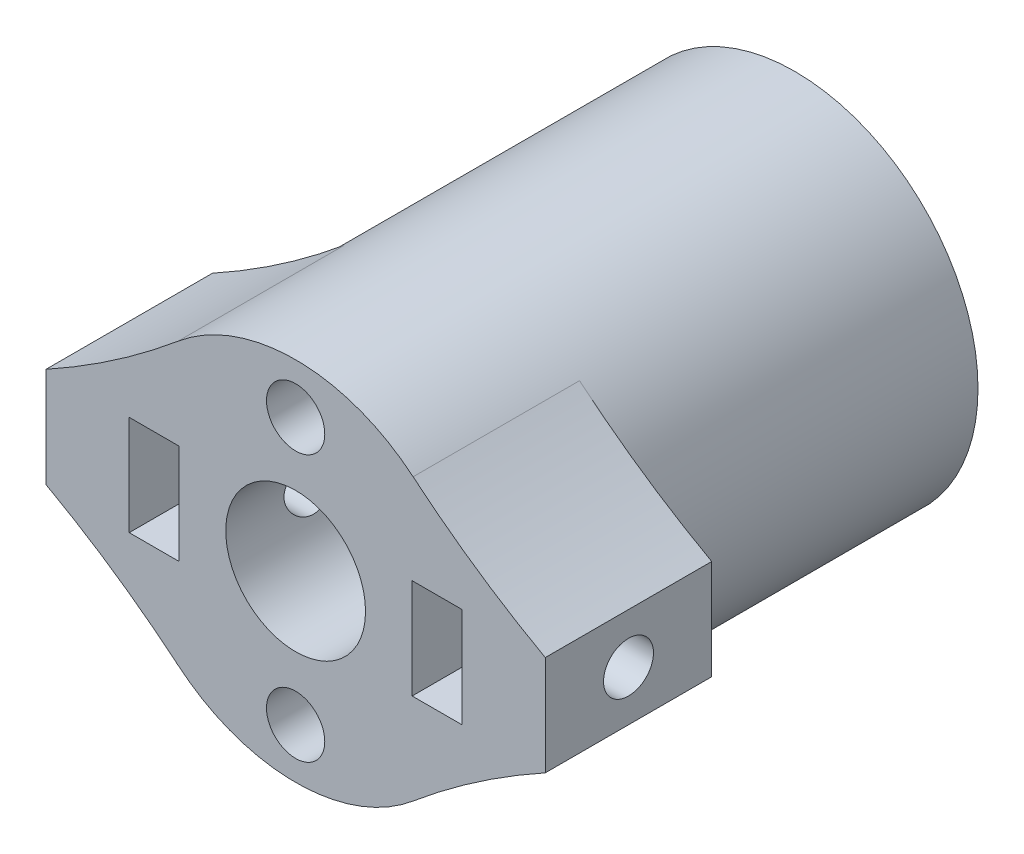
ISO-10303-21;
HEADER;
FILE_DESCRIPTION(('STEP AP214'),'2;1');
FILE_NAME('part.step','',(''),(''),'','','');
FILE_SCHEMA(('AUTOMOTIVE_DESIGN { 1 0 10303 214 1 1 1 1 }'));
ENDSEC;
DATA;
#1=APPLICATION_CONTEXT('core data for automotive mechanical design processes');
#2=APPLICATION_PROTOCOL_DEFINITION('international standard','automotive_design',2000,#1);
#3=PRODUCT_CONTEXT('',#1,'mechanical');
#4=PRODUCT('Part','Part','',(#3));
#5=PRODUCT_RELATED_PRODUCT_CATEGORY('part','',(#4));
#6=PRODUCT_DEFINITION_FORMATION('','',#4);
#7=PRODUCT_DEFINITION_CONTEXT('part definition',#1,'design');
#8=PRODUCT_DEFINITION('design','',#6,#7);
#9=PRODUCT_DEFINITION_SHAPE('','',#8);
#10=(LENGTH_UNIT() NAMED_UNIT(*) SI_UNIT(.MILLI.,.METRE.));
#11=(NAMED_UNIT(*) PLANE_ANGLE_UNIT() SI_UNIT($,.RADIAN.));
#12=(NAMED_UNIT(*) SI_UNIT($,.STERADIAN.) SOLID_ANGLE_UNIT());
#13=UNCERTAINTY_MEASURE_WITH_UNIT(LENGTH_MEASURE(1.E-05),#10,'distance_accuracy_value','');
#14=(GEOMETRIC_REPRESENTATION_CONTEXT(3) GLOBAL_UNCERTAINTY_ASSIGNED_CONTEXT((#13)) GLOBAL_UNIT_ASSIGNED_CONTEXT((#10,
#11,#12)) REPRESENTATION_CONTEXT('',''));
#15=CARTESIAN_POINT('',(0.,0.,0.));
#16=DIRECTION('',(0.,0.,1.));
#17=DIRECTION('',(1.,0.,0.));
#18=AXIS2_PLACEMENT_3D('',#15,#16,#17);
#19=CARTESIAN_POINT('',(0.,0.,19.));
#20=DIRECTION('',(0.,0.,-1.));
#21=DIRECTION('',(-1.,0.,0.));
#22=AXIS2_PLACEMENT_3D('',#19,#20,#21);
#23=CYLINDRICAL_SURFACE('',#22,11.);
#24=CARTESIAN_POINT('',(0.,0.,-11.));
#25=DIRECTION('',(0.,0.,-1.));
#26=DIRECTION('',(-1.,0.,0.));
#27=AXIS2_PLACEMENT_3D('',#24,#25,#26);
#28=CIRCLE('',#27,11.);
#29=CARTESIAN_POINT('',(-11.,0.,-11.));
#30=VERTEX_POINT('',#29);
#31=EDGE_CURVE('E361',#30,#30,#28,.T.);
#32=ORIENTED_EDGE('',*,*,#31,.F.);
#33=EDGE_LOOP('',(#32));
#34=FACE_BOUND('',#33,.T.);
#35=CARTESIAN_POINT('',(0.,0.,19.));
#36=DIRECTION('',(0.,0.,1.));
#37=DIRECTION('',(1.,0.,0.));
#38=AXIS2_PLACEMENT_3D('',#35,#36,#37);
#39=CIRCLE('',#38,11.);
#40=CARTESIAN_POINT('',(-7.05857871145963,-8.43661463942314,19.));
#41=VERTEX_POINT('',#40);
#42=CARTESIAN_POINT('',(7.05857871145963,-8.43661463942314,19.));
#43=VERTEX_POINT('',#42);
#44=EDGE_CURVE('E352',#41,#43,#39,.T.);
#45=ORIENTED_EDGE('',*,*,#44,.F.);
#46=DIRECTION('',(0.,0.,-1.));
#47=VECTOR('',#46,1.);
#48=CARTESIAN_POINT('',(-7.05857871145963,-8.43661463942315,19.));
#49=LINE('',#48,#47);
#50=CARTESIAN_POINT('',(-7.05857871145963,-8.43661463942314,9.));
#51=VERTEX_POINT('',#50);
#52=EDGE_CURVE('E341',#41,#51,#49,.T.);
#53=ORIENTED_EDGE('',*,*,#52,.T.);
#54=CARTESIAN_POINT('',(0.,0.,9.));
#55=DIRECTION('',(0.,0.,1.));
#56=DIRECTION('',(1.,0.,0.));
#57=AXIS2_PLACEMENT_3D('',#54,#55,#56);
#58=CIRCLE('',#57,11.);
#59=CARTESIAN_POINT('',(-7.05857871145963,8.43661463942314,9.));
#60=VERTEX_POINT('',#59);
#61=EDGE_CURVE('E54',#60,#51,#58,.T.);
#62=ORIENTED_EDGE('',*,*,#61,.F.);
#63=DIRECTION('',(0.,0.,-1.));
#64=VECTOR('',#63,1.);
#65=CARTESIAN_POINT('',(-7.05857871145963,8.43661463942315,19.));
#66=LINE('',#65,#64);
#67=CARTESIAN_POINT('',(-7.05857871145963,8.43661463942314,19.));
#68=VERTEX_POINT('',#67);
#69=EDGE_CURVE('E343',#60,#68,#66,.F.);
#70=ORIENTED_EDGE('',*,*,#69,.T.);
#71=CARTESIAN_POINT('',(7.05857871145963,8.43661463942314,19.));
#72=VERTEX_POINT('',#71);
#73=EDGE_CURVE('E349',#72,#68,#39,.T.);
#74=ORIENTED_EDGE('',*,*,#73,.F.);
#75=DIRECTION('',(0.,0.,-1.));
#76=VECTOR('',#75,1.);
#77=CARTESIAN_POINT('',(7.05857871145963,8.43661463942315,19.));
#78=LINE('',#77,#76);
#79=CARTESIAN_POINT('',(7.05857871145963,8.43661463942314,9.));
#80=VERTEX_POINT('',#79);
#81=EDGE_CURVE('E330',#72,#80,#78,.T.);
#82=ORIENTED_EDGE('',*,*,#81,.T.);
#83=CARTESIAN_POINT('',(0.,0.,9.));
#84=DIRECTION('',(0.,0.,-1.));
#85=DIRECTION('',(-1.,0.,0.));
#86=AXIS2_PLACEMENT_3D('',#83,#84,#85);
#87=CIRCLE('',#86,11.);
#88=CARTESIAN_POINT('',(7.05857871145963,-8.43661463942314,9.));
#89=VERTEX_POINT('',#88);
#90=EDGE_CURVE('E194',#80,#89,#87,.T.);
#91=ORIENTED_EDGE('',*,*,#90,.T.);
#92=DIRECTION('',(0.,0.,-1.));
#93=VECTOR('',#92,1.);
#94=CARTESIAN_POINT('',(7.05857871145963,-8.43661463942315,19.));
#95=LINE('',#94,#93);
#96=EDGE_CURVE('E346',#89,#43,#95,.F.);
#97=ORIENTED_EDGE('',*,*,#96,.T.);
#98=EDGE_LOOP('',(#45,#53,#62,#70,#74,#82,#91,#97));
#99=FACE_BOUND('',#98,.T.);
#100=ADVANCED_FACE('F39',(#34,#99),#23,.T.);
#101=CARTESIAN_POINT('',(0.,0.,19.));
#102=DIRECTION('',(0.,0.,1.));
#103=DIRECTION('',(1.,0.,0.));
#104=AXIS2_PLACEMENT_3D('',#101,#102,#103);
#105=PLANE('',#104);
#106=DIRECTION('',(0.,1.,0.));
#107=VECTOR('',#106,1.);
#108=CARTESIAN_POINT('',(-15.,-3.,19.));
#109=LINE('',#108,#107);
#110=CARTESIAN_POINT('',(-15.,-3.,19.));
#111=VERTEX_POINT('',#110);
#112=CARTESIAN_POINT('',(-15.,3.,19.));
#113=VERTEX_POINT('',#112);
#114=EDGE_CURVE('E176',#111,#113,#109,.T.);
#115=ORIENTED_EDGE('',*,*,#114,.F.);
#116=CARTESIAN_POINT('',(-39.1430273999125,-46.7848630004374,19.));
#117=DIRECTION('',(0.,0.,1.));
#118=DIRECTION('',(1.,0.,0.));
#119=AXIS2_PLACEMENT_3D('',#116,#117,#118);
#120=CIRCLE('',#119,50.);
#121=EDGE_CURVE('E156',#111,#41,#120,.F.);
#122=ORIENTED_EDGE('',*,*,#121,.T.);
#123=ORIENTED_EDGE('',*,*,#44,.T.);
#124=CARTESIAN_POINT('',(39.1430273999125,-46.7848630004374,19.));
#125=DIRECTION('',(0.,0.,1.));
#126=DIRECTION('',(1.,0.,0.));
#127=AXIS2_PLACEMENT_3D('',#124,#125,#126);
#128=CIRCLE('',#127,50.);
#129=CARTESIAN_POINT('',(15.,-3.,19.));
#130=VERTEX_POINT('',#129);
#131=EDGE_CURVE('E47',#43,#130,#128,.F.);
#132=ORIENTED_EDGE('',*,*,#131,.T.);
#133=DIRECTION('',(0.,1.,0.));
#134=VECTOR('',#133,1.);
#135=CARTESIAN_POINT('',(15.,-3.,19.));
#136=LINE('',#135,#134);
#137=CARTESIAN_POINT('',(15.,3.,19.));
#138=VERTEX_POINT('',#137);
#139=EDGE_CURVE('E185',#130,#138,#136,.T.);
#140=ORIENTED_EDGE('',*,*,#139,.T.);
#141=CARTESIAN_POINT('',(39.1430273999125,46.7848630004374,19.));
#142=DIRECTION('',(0.,0.,1.));
#143=DIRECTION('',(1.,0.,0.));
#144=AXIS2_PLACEMENT_3D('',#141,#142,#143);
#145=CIRCLE('',#144,50.);
#146=EDGE_CURVE('E327',#138,#72,#145,.F.);
#147=ORIENTED_EDGE('',*,*,#146,.T.);
#148=ORIENTED_EDGE('',*,*,#73,.T.);
#149=CARTESIAN_POINT('',(-39.1430273999125,46.7848630004374,19.));
#150=DIRECTION('',(0.,0.,1.));
#151=DIRECTION('',(1.,0.,0.));
#152=AXIS2_PLACEMENT_3D('',#149,#150,#151);
#153=CIRCLE('',#152,50.);
#154=EDGE_CURVE('E335',#68,#113,#153,.F.);
#155=ORIENTED_EDGE('',*,*,#154,.T.);
#156=EDGE_LOOP('',(#115,#122,#123,#132,#140,#147,#148,#155));
#157=FACE_BOUND('',#156,.T.);
#158=DIRECTION('',(1.,0.,0.));
#159=VECTOR('',#158,1.);
#160=CARTESIAN_POINT('',(-10.,-3.,19.));
#161=LINE('',#160,#159);
#162=CARTESIAN_POINT('',(-10.,-3.,19.));
#163=VERTEX_POINT('',#162);
#164=CARTESIAN_POINT('',(-7.,-3.,19.));
#165=VERTEX_POINT('',#164);
#166=EDGE_CURVE('E437',#163,#165,#161,.T.);
#167=ORIENTED_EDGE('',*,*,#166,.F.);
#168=DIRECTION('',(0.,-1.,0.));
#169=VECTOR('',#168,1.);
#170=CARTESIAN_POINT('',(-10.,3.,19.));
#171=LINE('',#170,#169);
#172=CARTESIAN_POINT('',(-10.,3.,19.));
#173=VERTEX_POINT('',#172);
#174=EDGE_CURVE('E404',#173,#163,#171,.T.);
#175=ORIENTED_EDGE('',*,*,#174,.F.);
#176=DIRECTION('',(-1.,0.,0.));
#177=VECTOR('',#176,1.);
#178=CARTESIAN_POINT('',(-10.,3.,19.));
#179=LINE('',#178,#177);
#180=CARTESIAN_POINT('',(-7.,3.,19.));
#181=VERTEX_POINT('',#180);
#182=EDGE_CURVE('E430',#181,#173,#179,.T.);
#183=ORIENTED_EDGE('',*,*,#182,.F.);
#184=DIRECTION('',(0.,1.,0.));
#185=VECTOR('',#184,1.);
#186=CARTESIAN_POINT('',(-7.,3.,19.));
#187=LINE('',#186,#185);
#188=EDGE_CURVE('E434',#165,#181,#187,.T.);
#189=ORIENTED_EDGE('',*,*,#188,.F.);
#190=EDGE_LOOP('',(#167,#175,#183,#189));
#191=FACE_BOUND('',#190,.T.);
#192=DIRECTION('',(0.,1.,0.));
#193=VECTOR('',#192,1.);
#194=CARTESIAN_POINT('',(10.,3.,19.));
#195=LINE('',#194,#193);
#196=CARTESIAN_POINT('',(10.,-3.,19.));
#197=VERTEX_POINT('',#196);
#198=CARTESIAN_POINT('',(10.,3.,19.));
#199=VERTEX_POINT('',#198);
#200=EDGE_CURVE('E402',#197,#199,#195,.T.);
#201=ORIENTED_EDGE('',*,*,#200,.F.);
#202=DIRECTION('',(1.,0.,0.));
#203=VECTOR('',#202,1.);
#204=CARTESIAN_POINT('',(10.,-3.,19.));
#205=LINE('',#204,#203);
#206=CARTESIAN_POINT('',(7.,-3.,19.));
#207=VERTEX_POINT('',#206);
#208=EDGE_CURVE('E391',#207,#197,#205,.T.);
#209=ORIENTED_EDGE('',*,*,#208,.F.);
#210=DIRECTION('',(0.,-1.,0.));
#211=VECTOR('',#210,1.);
#212=CARTESIAN_POINT('',(7.,3.,19.));
#213=LINE('',#212,#211);
#214=CARTESIAN_POINT('',(7.,3.,19.));
#215=VERTEX_POINT('',#214);
#216=EDGE_CURVE('E408',#215,#207,#213,.T.);
#217=ORIENTED_EDGE('',*,*,#216,.F.);
#218=DIRECTION('',(-1.,0.,0.));
#219=VECTOR('',#218,1.);
#220=CARTESIAN_POINT('',(10.,3.,19.));
#221=LINE('',#220,#219);
#222=EDGE_CURVE('E405',#199,#215,#221,.T.);
#223=ORIENTED_EDGE('',*,*,#222,.F.);
#224=EDGE_LOOP('',(#201,#209,#217,#223));
#225=FACE_BOUND('',#224,.T.);
#226=CARTESIAN_POINT('',(0.,0.,19.));
#227=DIRECTION('',(0.,0.,1.));
#228=DIRECTION('',(1.,0.,0.));
#229=AXIS2_PLACEMENT_3D('',#226,#227,#228);
#230=CIRCLE('',#229,4.2);
#231=CARTESIAN_POINT('',(4.2,0.,19.));
#232=VERTEX_POINT('',#231);
#233=EDGE_CURVE('E371',#232,#232,#230,.T.);
#234=ORIENTED_EDGE('',*,*,#233,.F.);
#235=EDGE_LOOP('',(#234));
#236=FACE_BOUND('',#235,.T.);
#237=CARTESIAN_POINT('',(0.,8.,19.));
#238=DIRECTION('',(0.,0.,1.));
#239=DIRECTION('',(1.,0.,0.));
#240=AXIS2_PLACEMENT_3D('',#237,#238,#239);
#241=CIRCLE('',#240,1.75);
#242=CARTESIAN_POINT('',(1.75,8.,19.));
#243=VERTEX_POINT('',#242);
#244=EDGE_CURVE('E355',#243,#243,#241,.T.);
#245=ORIENTED_EDGE('',*,*,#244,.F.);
#246=EDGE_LOOP('',(#245));
#247=FACE_BOUND('',#246,.T.);
#248=CARTESIAN_POINT('',(0.,-8.,19.));
#249=DIRECTION('',(0.,0.,1.));
#250=DIRECTION('',(1.,0.,0.));
#251=AXIS2_PLACEMENT_3D('',#248,#249,#250);
#252=CIRCLE('',#251,1.75);
#253=CARTESIAN_POINT('',(1.75,-8.,19.));
#254=VERTEX_POINT('',#253);
#255=EDGE_CURVE('E358',#254,#254,#252,.T.);
#256=ORIENTED_EDGE('',*,*,#255,.F.);
#257=EDGE_LOOP('',(#256));
#258=FACE_BOUND('',#257,.T.);
#259=ADVANCED_FACE('F299',(#157,#191,#225,#236,#247,#258),#105,.T.);
#260=CARTESIAN_POINT('',(0.,8.,19.));
#261=DIRECTION('',(0.,0.,-1.));
#262=DIRECTION('',(-1.,0.,0.));
#263=AXIS2_PLACEMENT_3D('',#260,#261,#262);
#264=CYLINDRICAL_SURFACE('',#263,1.75);
#265=ORIENTED_EDGE('',*,*,#244,.T.);
#266=EDGE_LOOP('',(#265));
#267=FACE_BOUND('',#266,.T.);
#268=CARTESIAN_POINT('',(0.,8.,-11.));
#269=DIRECTION('',(0.,0.,-1.));
#270=DIRECTION('',(-1.,0.,0.));
#271=AXIS2_PLACEMENT_3D('',#268,#269,#270);
#272=CIRCLE('',#271,1.75);
#273=CARTESIAN_POINT('',(-1.75,8.,-11.));
#274=VERTEX_POINT('',#273);
#275=EDGE_CURVE('E364',#274,#274,#272,.T.);
#276=ORIENTED_EDGE('',*,*,#275,.T.);
#277=EDGE_LOOP('',(#276));
#278=FACE_BOUND('',#277,.T.);
#279=ADVANCED_FACE('F307',(#267,#278),#264,.F.);
#280=CARTESIAN_POINT('',(0.,-8.,19.));
#281=DIRECTION('',(0.,0.,-1.));
#282=DIRECTION('',(-1.,0.,0.));
#283=AXIS2_PLACEMENT_3D('',#280,#281,#282);
#284=CYLINDRICAL_SURFACE('',#283,1.75);
#285=ORIENTED_EDGE('',*,*,#255,.T.);
#286=EDGE_LOOP('',(#285));
#287=FACE_BOUND('',#286,.T.);
#288=CARTESIAN_POINT('',(0.,-8.,-11.));
#289=DIRECTION('',(0.,0.,-1.));
#290=DIRECTION('',(-1.,0.,0.));
#291=AXIS2_PLACEMENT_3D('',#288,#289,#290);
#292=CIRCLE('',#291,1.75);
#293=CARTESIAN_POINT('',(-1.75,-8.,-11.));
#294=VERTEX_POINT('',#293);
#295=EDGE_CURVE('E367',#294,#294,#292,.T.);
#296=ORIENTED_EDGE('',*,*,#295,.T.);
#297=EDGE_LOOP('',(#296));
#298=FACE_BOUND('',#297,.T.);
#299=ADVANCED_FACE('F471',(#287,#298),#284,.F.);
#300=CARTESIAN_POINT('',(0.,0.,-11.));
#301=DIRECTION('',(0.,0.,-1.));
#302=DIRECTION('',(-1.,0.,0.));
#303=AXIS2_PLACEMENT_3D('',#300,#301,#302);
#304=PLANE('',#303);
#305=CARTESIAN_POINT('',(0.,0.,-11.));
#306=DIRECTION('',(0.,0.,-1.));
#307=DIRECTION('',(-1.,0.,0.));
#308=AXIS2_PLACEMENT_3D('',#305,#306,#307);
#309=CIRCLE('',#308,5.);
#310=CARTESIAN_POINT('',(-5.,0.,-11.));
#311=VERTEX_POINT('',#310);
#312=EDGE_CURVE('E376',#311,#311,#309,.T.);
#313=ORIENTED_EDGE('',*,*,#312,.F.);
#314=EDGE_LOOP('',(#313));
#315=FACE_BOUND('',#314,.T.);
#316=ORIENTED_EDGE('',*,*,#275,.F.);
#317=EDGE_LOOP('',(#316));
#318=FACE_BOUND('',#317,.T.);
#319=ORIENTED_EDGE('',*,*,#31,.T.);
#320=EDGE_LOOP('',(#319));
#321=FACE_BOUND('',#320,.T.);
#322=ORIENTED_EDGE('',*,*,#295,.F.);
#323=EDGE_LOOP('',(#322));
#324=FACE_BOUND('',#323,.T.);
#325=ADVANCED_FACE('F294',(#315,#318,#321,#324),#304,.T.);
#326=CARTESIAN_POINT('',(0.,0.,-1.));
#327=DIRECTION('',(0.,0.,1.));
#328=DIRECTION('',(1.,0.,0.));
#329=AXIS2_PLACEMENT_3D('',#326,#327,#328);
#330=CYLINDRICAL_SURFACE('',#329,4.2);
#331=CARTESIAN_POINT('',(4.2,0.,12.5));
#332=CARTESIAN_POINT('',(4.2000012177177,0.0815038563112409,12.4999983055749));
#333=CARTESIAN_POINT('',(4.1976063396219,0.162995657968519,12.5066640543397));
#334=CARTESIAN_POINT('',(4.1882904296917,0.323558937964139,12.5330547723152));
#335=CARTESIAN_POINT('',(4.18136957062649,0.402630508568777,12.5527792430389));
#336=CARTESIAN_POINT('',(4.16374865886589,0.55601527000459,12.6045110847605));
#337=CARTESIAN_POINT('',(4.15305547634608,0.630336822875514,12.636496135832));
#338=CARTESIAN_POINT('',(4.12896646819412,0.772557511790407,12.7117332316206));
#339=CARTESIAN_POINT('',(4.11556999523987,0.840455103840449,12.7549879756694));
#340=CARTESIAN_POINT('',(4.08688426457852,0.97055281683208,12.8533058792698));
#341=CARTESIAN_POINT('',(4.07154496467043,1.03246809403711,12.9087312386032));
#342=CARTESIAN_POINT('',(4.04096113521759,1.14634919593458,13.0290478182739));
#343=CARTESIAN_POINT('',(4.02571663194116,1.19831237220808,13.0939415502298));
#344=CARTESIAN_POINT('',(3.99648042101382,1.29254241337105,13.2340386756654));
#345=CARTESIAN_POINT('',(3.98254864657076,1.33442117876898,13.3095168461099));
#346=CARTESIAN_POINT('',(3.95828611470903,1.40476543338002,13.4670221988226));
#347=CARTESIAN_POINT('',(3.94795407092859,1.43323571538928,13.5490470287406));
#348=CARTESIAN_POINT('',(3.93259222933234,1.47485478269117,13.7140537017215));
#349=CARTESIAN_POINT('',(3.92737640027401,1.48854311644399,13.7968815841659));
#350=CARTESIAN_POINT('',(3.92229037127883,1.50189691336488,13.9638101790943));
#351=CARTESIAN_POINT('',(3.92241821913677,1.50156749763584,14.0479104155249));
#352=CARTESIAN_POINT('',(3.92784352978317,1.48731047383398,14.2102133930315));
#353=CARTESIAN_POINT('',(3.93286418201424,1.47411097058189,14.2884910117998));
#354=CARTESIAN_POINT('',(3.94705249304629,1.43568510633036,14.44163691631));
#355=CARTESIAN_POINT('',(3.9562207183384,1.41045710240768,14.5165047347905));
#356=CARTESIAN_POINT('',(3.97785102292688,1.3482574010646,14.6622642474714));
#357=CARTESIAN_POINT('',(3.99036868665025,1.31108517559954,14.7330617615951));
#358=CARTESIAN_POINT('',(4.01726681817821,1.22619163614417,14.8676338319898));
#359=CARTESIAN_POINT('',(4.03164788438803,1.1784669298814,14.9314061199844));
#360=CARTESIAN_POINT('',(4.06171499079536,1.07041889428265,15.0541757548227));
#361=CARTESIAN_POINT('',(4.0774273408461,1.00950798909263,15.1126507155495));
#362=CARTESIAN_POINT('',(4.10763284163309,0.878557107209485,15.2187030097009));
#363=CARTESIAN_POINT('',(4.12212583808417,0.808515978116219,15.2662789653793));
#364=CARTESIAN_POINT('',(4.14850199233201,0.660060205753051,15.3496883659635));
#365=CARTESIAN_POINT('',(4.16034919302249,0.581549467455125,15.3853629439339));
#366=CARTESIAN_POINT('',(4.17983500612413,0.419114080876348,15.4428294944962));
#367=CARTESIAN_POINT('',(4.18747530675381,0.33519161943226,15.4646270364576));
#368=CARTESIAN_POINT('',(4.19739721579282,0.1687230550883,15.4927514903957));
#369=CARTESIAN_POINT('',(4.19992262399456,0.0863103679014552,15.4997828784474));
#370=CARTESIAN_POINT('',(4.2000737873443,-0.0785456229440366,15.5002070731941));
#371=CARTESIAN_POINT('',(4.19770051113874,-0.160988917327603,15.4936025761951));
#372=CARTESIAN_POINT('',(4.18848209997144,-0.320621219398661,15.4674883176071));
#373=CARTESIAN_POINT('',(4.18179250691652,-0.397893508848839,15.4484271465211));
#374=CARTESIAN_POINT('',(4.16476947478007,-0.548099666417996,15.3985180431584));
#375=CARTESIAN_POINT('',(4.15443556259946,-0.6210329698201,15.3676685805029));
#376=CARTESIAN_POINT('',(4.13079443743997,-0.762790745109007,15.294104687959));
#377=CARTESIAN_POINT('',(4.11741157477394,-0.831441277792332,15.2510801117004));
#378=CARTESIAN_POINT('',(4.0891703730828,-0.960767621384223,15.1547435029355));
#379=CARTESIAN_POINT('',(4.07431152872071,-1.02144068438375,15.1014279411357));
#380=CARTESIAN_POINT('',(4.04379624576272,-1.13641375235852,14.9827222203626));
#381=CARTESIAN_POINT('',(4.02813887919778,-1.19021209144182,14.9168451721882));
#382=CARTESIAN_POINT('',(3.99856725598626,-1.28607315468959,14.7766752379974));
#383=CARTESIAN_POINT('',(3.98465308446608,-1.32813530585733,14.7023819413228));
#384=CARTESIAN_POINT('',(3.96024199773964,-1.39925211656527,14.5471611144584));
#385=CARTESIAN_POINT('',(3.94974874055726,-1.42829286453624,14.4662265976941));
#386=CARTESIAN_POINT('',(3.93360865202545,-1.47216851410049,14.3001439395679));
#387=CARTESIAN_POINT('',(3.92795919493157,-1.48701111278268,14.2149981076026));
#388=CARTESIAN_POINT('',(3.922473578567,-1.50141753304117,14.0482877123762));
#389=CARTESIAN_POINT('',(3.92231584053899,-1.50182656186909,13.9668060713453));
#390=CARTESIAN_POINT('',(3.92701991678263,-1.48948221005321,13.8050013976071));
#391=CARTESIAN_POINT('',(3.93188134052537,-1.47672985346525,13.7246782752511));
#392=CARTESIAN_POINT('',(3.94582020256671,-1.43905804564316,13.5694996487769));
#393=CARTESIAN_POINT('',(3.95478884549397,-1.41445176605361,13.4945575405965));
#394=CARTESIAN_POINT('',(3.97587797589071,-1.35403586602902,13.3498143908799));
#395=CARTESIAN_POINT('',(3.98799922166789,-1.31822354974137,13.2800145914335));
#396=CARTESIAN_POINT('',(4.014763385969,-1.23438187843143,13.1438445500286));
#397=CARTESIAN_POINT('',(4.02950040202118,-1.18584222957104,13.0778071754823));
#398=CARTESIAN_POINT('',(4.0594824679699,-1.07874517807154,12.9545434972037));
#399=CARTESIAN_POINT('',(4.07472767036316,-1.02018474620149,12.8973198677894));
#400=CARTESIAN_POINT('',(4.10487267400624,-0.891397514037147,12.7905668583101));
#401=CARTESIAN_POINT('',(4.11972220242458,-0.820750503700229,12.7415281761255));
#402=CARTESIAN_POINT('',(4.14662954641107,-0.671706787496786,12.6560554016973));
#403=CARTESIAN_POINT('',(4.15868757315788,-0.593310668495363,12.6196203558784));
#404=CARTESIAN_POINT('',(4.178676037085,-0.43058780191499,12.5605158138148));
#405=CARTESIAN_POINT('',(4.18658893184338,-0.346237536280671,12.5379047551024));
#406=CARTESIAN_POINT('',(4.19724925366555,-0.174586128680893,12.5076506752167));
#407=CARTESIAN_POINT('',(4.19999869589126,-0.087286151458696,12.5000018146362));
#408=CARTESIAN_POINT('',(4.2,0.,12.5));
#409=B_SPLINE_CURVE_WITH_KNOTS('',3,(#331,#332,#333,#334,#335,#336,#337,#338,#339,#340,#341,
#342,#343,#344,#345,#346,#347,#348,#349,#350,#351,#352,#353,#354,#355,#356,#357,#358,#359,#360,
#361,#362,#363,#364,#365,#366,#367,#368,#369,#370,#371,#372,#373,#374,#375,#376,#377,#378,#379,
#380,#381,#382,#383,#384,#385,#386,#387,#388,#389,#390,#391,#392,#393,#394,#395,#396,#397,#398,
#399,#400,#401,#402,#403,#404,#405,#406,#407,#408),.UNSPECIFIED.,.T.,.F.,(4,2,2,2,2,2,2,2,2,2,2,
2,2,2,2,2,2,2,2,2,2,2,2,2,2,2,2,2,2,2,2,2,2,2,2,2,2,2,4),(0.,0.244189930285772,
0.488370539711959,0.732108722553775,0.975905339642989,1.22828743475713,1.48073659988962,
1.74173764068201,2.0026453170021,2.25366937427235,2.50460172573871,2.74211547898768,
2.97966168255694,3.22142489801681,3.4632659456152,3.71973991881082,3.97624629508283,
4.23605114858176,4.49575166691344,4.74275117947249,4.98970185600496,5.22821596081696,
5.46676104051475,5.71203514171874,5.95739350961588,6.21563030783112,6.47387971175454,
6.73240436587843,6.99078878927049,7.23401585743853,7.47722400211842,7.71433249418408,
7.95149807169754,8.20022067151471,8.44901859214481,8.70956061470955,8.97008292067891,
9.23169904097482,9.49321303803305),.UNSPECIFIED.);
#410=CARTESIAN_POINT('',(4.2,0.,12.5));
#411=VERTEX_POINT('',#410);
#412=EDGE_CURVE('E214',#411,#411,#409,.T.);
#413=ORIENTED_EDGE('',*,*,#412,.T.);
#414=EDGE_LOOP('',(#413));
#415=FACE_BOUND('',#414,.T.);
#416=CARTESIAN_POINT('',(-4.2,0.,12.5));
#417=CARTESIAN_POINT('',(-4.2000012177177,-0.0815038563112409,12.4999983055749));
#418=CARTESIAN_POINT('',(-4.1976063396219,-0.162995657968519,12.5066640543397));
#419=CARTESIAN_POINT('',(-4.1882904296917,-0.323558937964139,12.5330547723152));
#420=CARTESIAN_POINT('',(-4.18136957062649,-0.402630508568777,12.5527792430389));
#421=CARTESIAN_POINT('',(-4.16374865886589,-0.55601527000459,12.6045110847605));
#422=CARTESIAN_POINT('',(-4.15305547634608,-0.630336822875514,12.636496135832));
#423=CARTESIAN_POINT('',(-4.12896646819412,-0.772557511790407,12.7117332316206));
#424=CARTESIAN_POINT('',(-4.11556999523987,-0.840455103840449,12.7549879756694));
#425=CARTESIAN_POINT('',(-4.08688426457852,-0.97055281683208,12.8533058792698));
#426=CARTESIAN_POINT('',(-4.07154496467043,-1.03246809403711,12.9087312386032));
#427=CARTESIAN_POINT('',(-4.04096113521759,-1.14634919593458,13.0290478182739));
#428=CARTESIAN_POINT('',(-4.02571663194116,-1.19831237220808,13.0939415502298));
#429=CARTESIAN_POINT('',(-3.99648042101382,-1.29254241337105,13.2340386756654));
#430=CARTESIAN_POINT('',(-3.98254864657076,-1.33442117876898,13.3095168461099));
#431=CARTESIAN_POINT('',(-3.95828611470903,-1.40476543338002,13.4670221988226));
#432=CARTESIAN_POINT('',(-3.94795407092859,-1.43323571538928,13.5490470287406));
#433=CARTESIAN_POINT('',(-3.93259222933234,-1.47485478269117,13.7140537017215));
#434=CARTESIAN_POINT('',(-3.92737640027401,-1.48854311644399,13.7968815841659));
#435=CARTESIAN_POINT('',(-3.92229037127883,-1.50189691336488,13.9638101790943));
#436=CARTESIAN_POINT('',(-3.92241821913677,-1.50156749763584,14.0479104155249));
#437=CARTESIAN_POINT('',(-3.92784352978317,-1.48731047383398,14.2102133930315));
#438=CARTESIAN_POINT('',(-3.93286418201424,-1.47411097058189,14.2884910117998));
#439=CARTESIAN_POINT('',(-3.94705249304629,-1.43568510633036,14.44163691631));
#440=CARTESIAN_POINT('',(-3.9562207183384,-1.41045710240768,14.5165047347905));
#441=CARTESIAN_POINT('',(-3.97785102292688,-1.3482574010646,14.6622642474714));
#442=CARTESIAN_POINT('',(-3.99036868665025,-1.31108517559954,14.7330617615951));
#443=CARTESIAN_POINT('',(-4.01726681817821,-1.22619163614417,14.8676338319898));
#444=CARTESIAN_POINT('',(-4.03164788438803,-1.1784669298814,14.9314061199844));
#445=CARTESIAN_POINT('',(-4.06171499079536,-1.07041889428265,15.0541757548227));
#446=CARTESIAN_POINT('',(-4.0774273408461,-1.00950798909263,15.1126507155495));
#447=CARTESIAN_POINT('',(-4.10763284163309,-0.878557107209485,15.2187030097009));
#448=CARTESIAN_POINT('',(-4.12212583808417,-0.808515978116219,15.2662789653793));
#449=CARTESIAN_POINT('',(-4.14850199233201,-0.660060205753051,15.3496883659635));
#450=CARTESIAN_POINT('',(-4.16034919302249,-0.581549467455125,15.3853629439339));
#451=CARTESIAN_POINT('',(-4.17983500612413,-0.419114080876348,15.4428294944962));
#452=CARTESIAN_POINT('',(-4.18747530675381,-0.33519161943226,15.4646270364576));
#453=CARTESIAN_POINT('',(-4.19739721579282,-0.1687230550883,15.4927514903957));
#454=CARTESIAN_POINT('',(-4.19992262399456,-0.0863103679014552,15.4997828784474));
#455=CARTESIAN_POINT('',(-4.2000737873443,0.0785456229440366,15.5002070731941));
#456=CARTESIAN_POINT('',(-4.19770051113874,0.160988917327603,15.4936025761951));
#457=CARTESIAN_POINT('',(-4.18848209997144,0.320621219398661,15.4674883176071));
#458=CARTESIAN_POINT('',(-4.18179250691652,0.397893508848839,15.4484271465211));
#459=CARTESIAN_POINT('',(-4.16476947478007,0.548099666417996,15.3985180431584));
#460=CARTESIAN_POINT('',(-4.15443556259946,0.6210329698201,15.3676685805029));
#461=CARTESIAN_POINT('',(-4.13079443743997,0.762790745109007,15.294104687959));
#462=CARTESIAN_POINT('',(-4.11741157477394,0.831441277792332,15.2510801117004));
#463=CARTESIAN_POINT('',(-4.0891703730828,0.960767621384223,15.1547435029355));
#464=CARTESIAN_POINT('',(-4.07431152872071,1.02144068438375,15.1014279411357));
#465=CARTESIAN_POINT('',(-4.04379624576272,1.13641375235852,14.9827222203626));
#466=CARTESIAN_POINT('',(-4.02813887919778,1.19021209144182,14.9168451721882));
#467=CARTESIAN_POINT('',(-3.99856725598626,1.28607315468959,14.7766752379974));
#468=CARTESIAN_POINT('',(-3.98465308446608,1.32813530585733,14.7023819413228));
#469=CARTESIAN_POINT('',(-3.96024199773964,1.39925211656527,14.5471611144584));
#470=CARTESIAN_POINT('',(-3.94974874055726,1.42829286453624,14.4662265976941));
#471=CARTESIAN_POINT('',(-3.93360865202545,1.47216851410049,14.3001439395679));
#472=CARTESIAN_POINT('',(-3.92795919493157,1.48701111278268,14.2149981076026));
#473=CARTESIAN_POINT('',(-3.922473578567,1.50141753304117,14.0482877123762));
#474=CARTESIAN_POINT('',(-3.92231584053899,1.50182656186909,13.9668060713453));
#475=CARTESIAN_POINT('',(-3.92701991678263,1.48948221005321,13.8050013976071));
#476=CARTESIAN_POINT('',(-3.93188134052537,1.47672985346525,13.7246782752511));
#477=CARTESIAN_POINT('',(-3.94582020256671,1.43905804564316,13.5694996487769));
#478=CARTESIAN_POINT('',(-3.95478884549397,1.41445176605361,13.4945575405965));
#479=CARTESIAN_POINT('',(-3.97587797589071,1.35403586602902,13.3498143908799));
#480=CARTESIAN_POINT('',(-3.98799922166789,1.31822354974137,13.2800145914335));
#481=CARTESIAN_POINT('',(-4.014763385969,1.23438187843143,13.1438445500286));
#482=CARTESIAN_POINT('',(-4.02950040202118,1.18584222957104,13.0778071754823));
#483=CARTESIAN_POINT('',(-4.0594824679699,1.07874517807154,12.9545434972037));
#484=CARTESIAN_POINT('',(-4.07472767036316,1.02018474620149,12.8973198677894));
#485=CARTESIAN_POINT('',(-4.10487267400624,0.891397514037147,12.7905668583101));
#486=CARTESIAN_POINT('',(-4.11972220242458,0.820750503700229,12.7415281761255));
#487=CARTESIAN_POINT('',(-4.14662954641107,0.671706787496786,12.6560554016973));
#488=CARTESIAN_POINT('',(-4.15868757315788,0.593310668495363,12.6196203558784));
#489=CARTESIAN_POINT('',(-4.178676037085,0.43058780191499,12.5605158138148));
#490=CARTESIAN_POINT('',(-4.18658893184338,0.346237536280671,12.5379047551024));
#491=CARTESIAN_POINT('',(-4.19724925366555,0.174586128680893,12.5076506752167));
#492=CARTESIAN_POINT('',(-4.19999869589126,0.087286151458696,12.5000018146362));
#493=CARTESIAN_POINT('',(-4.2,0.,12.5));
#494=B_SPLINE_CURVE_WITH_KNOTS('',3,(#416,#417,#418,#419,#420,#421,#422,#423,#424,#425,#426,
#427,#428,#429,#430,#431,#432,#433,#434,#435,#436,#437,#438,#439,#440,#441,#442,#443,#444,#445,
#446,#447,#448,#449,#450,#451,#452,#453,#454,#455,#456,#457,#458,#459,#460,#461,#462,#463,#464,
#465,#466,#467,#468,#469,#470,#471,#472,#473,#474,#475,#476,#477,#478,#479,#480,#481,#482,#483,
#484,#485,#486,#487,#488,#489,#490,#491,#492,#493),.UNSPECIFIED.,.T.,.F.,(4,2,2,2,2,2,2,2,2,2,2,
2,2,2,2,2,2,2,2,2,2,2,2,2,2,2,2,2,2,2,2,2,2,2,2,2,2,2,4),(0.,0.244189930285772,
0.488370539711959,0.732108722553775,0.975905339642989,1.22828743475713,1.48073659988962,
1.74173764068201,2.0026453170021,2.25366937427235,2.50460172573871,2.74211547898768,
2.97966168255694,3.22142489801681,3.4632659456152,3.71973991881082,3.97624629508283,
4.23605114858176,4.49575166691344,4.74275117947249,4.98970185600496,5.22821596081696,
5.46676104051475,5.71203514171874,5.95739350961588,6.21563030783112,6.47387971175454,
6.73240436587843,6.99078878927049,7.23401585743853,7.47722400211842,7.71433249418408,
7.95149807169754,8.20022067151471,8.44901859214481,8.70956061470955,8.97008292067891,
9.23169904097482,9.49321303803305),.UNSPECIFIED.);
#495=CARTESIAN_POINT('',(-4.2,0.,12.5));
#496=VERTEX_POINT('',#495);
#497=EDGE_CURVE('E206',#496,#496,#494,.T.);
#498=ORIENTED_EDGE('',*,*,#497,.T.);
#499=EDGE_LOOP('',(#498));
#500=FACE_BOUND('',#499,.T.);
#501=ORIENTED_EDGE('',*,*,#233,.T.);
#502=EDGE_LOOP('',(#501));
#503=FACE_BOUND('',#502,.T.);
#504=CARTESIAN_POINT('',(0.,0.,-1.));
#505=DIRECTION('',(0.,0.,1.));
#506=DIRECTION('',(1.,0.,0.));
#507=AXIS2_PLACEMENT_3D('',#504,#505,#506);
#508=CIRCLE('',#507,4.2);
#509=CARTESIAN_POINT('',(4.2,0.,-1.));
#510=VERTEX_POINT('',#509);
#511=EDGE_CURVE('E370',#510,#510,#508,.T.);
#512=ORIENTED_EDGE('',*,*,#511,.F.);
#513=EDGE_LOOP('',(#512));
#514=FACE_BOUND('',#513,.T.);
#515=ADVANCED_FACE('F219',(#415,#500,#503,#514),#330,.F.);
#516=CARTESIAN_POINT('',(0.,0.,-1.));
#517=DIRECTION('',(0.,0.,1.));
#518=DIRECTION('',(1.,0.,0.));
#519=AXIS2_PLACEMENT_3D('',#516,#517,#518);
#520=PLANE('',#519);
#521=ORIENTED_EDGE('',*,*,#511,.T.);
#522=EDGE_LOOP('',(#521));
#523=FACE_BOUND('',#522,.T.);
#524=CARTESIAN_POINT('',(0.,0.,-0.999999999999999));
#525=DIRECTION('',(0.,0.,-1.));
#526=DIRECTION('',(-1.,0.,0.));
#527=AXIS2_PLACEMENT_3D('',#524,#525,#526);
#528=CIRCLE('',#527,2.2);
#529=CARTESIAN_POINT('',(-2.2,0.,-0.999999999999999));
#530=VERTEX_POINT('',#529);
#531=EDGE_CURVE('E379',#530,#530,#528,.T.);
#532=ORIENTED_EDGE('',*,*,#531,.T.);
#533=EDGE_LOOP('',(#532));
#534=FACE_BOUND('',#533,.T.);
#535=ADVANCED_FACE('F285',(#523,#534),#520,.T.);
#536=CARTESIAN_POINT('',(0.,0.,-6.));
#537=DIRECTION('',(0.,0.,-1.));
#538=DIRECTION('',(-1.,0.,0.));
#539=AXIS2_PLACEMENT_3D('',#536,#537,#538);
#540=CYLINDRICAL_SURFACE('',#539,5.);
#541=CARTESIAN_POINT('',(0.,0.,-6.));
#542=DIRECTION('',(0.,0.,-1.));
#543=DIRECTION('',(-1.,0.,0.));
#544=AXIS2_PLACEMENT_3D('',#541,#542,#543);
#545=CIRCLE('',#544,5.);
#546=CARTESIAN_POINT('',(-5.,0.,-6.));
#547=VERTEX_POINT('',#546);
#548=EDGE_CURVE('E374',#547,#547,#545,.T.);
#549=ORIENTED_EDGE('',*,*,#548,.F.);
#550=EDGE_LOOP('',(#549));
#551=FACE_BOUND('',#550,.T.);
#552=ORIENTED_EDGE('',*,*,#312,.T.);
#553=EDGE_LOOP('',(#552));
#554=FACE_BOUND('',#553,.T.);
#555=ADVANCED_FACE('F282',(#551,#554),#540,.F.);
#556=CARTESIAN_POINT('',(0.,0.,-6.));
#557=DIRECTION('',(0.,0.,-1.));
#558=DIRECTION('',(-1.,0.,0.));
#559=AXIS2_PLACEMENT_3D('',#556,#557,#558);
#560=PLANE('',#559);
#561=CARTESIAN_POINT('',(0.,0.,-6.));
#562=DIRECTION('',(0.,0.,-1.));
#563=DIRECTION('',(-1.,0.,0.));
#564=AXIS2_PLACEMENT_3D('',#561,#562,#563);
#565=CIRCLE('',#564,2.2);
#566=CARTESIAN_POINT('',(-2.2,0.,-6.));
#567=VERTEX_POINT('',#566);
#568=EDGE_CURVE('E382',#567,#567,#565,.T.);
#569=ORIENTED_EDGE('',*,*,#568,.F.);
#570=EDGE_LOOP('',(#569));
#571=FACE_BOUND('',#570,.T.);
#572=ORIENTED_EDGE('',*,*,#548,.T.);
#573=EDGE_LOOP('',(#572));
#574=FACE_BOUND('',#573,.T.);
#575=ADVANCED_FACE('F278',(#571,#574),#560,.T.);
#576=CARTESIAN_POINT('',(0.,0.,-0.999999999999999));
#577=DIRECTION('',(0.,0.,-1.));
#578=DIRECTION('',(-1.,0.,0.));
#579=AXIS2_PLACEMENT_3D('',#576,#577,#578);
#580=CYLINDRICAL_SURFACE('',#579,2.2);
#581=ORIENTED_EDGE('',*,*,#531,.F.);
#582=EDGE_LOOP('',(#581));
#583=FACE_BOUND('',#582,.T.);
#584=ORIENTED_EDGE('',*,*,#568,.T.);
#585=EDGE_LOOP('',(#584));
#586=FACE_BOUND('',#585,.T.);
#587=ADVANCED_FACE('F260',(#583,#586),#580,.F.);
#588=CARTESIAN_POINT('',(10.,3.,9.));
#589=DIRECTION('',(1.,0.,0.));
#590=DIRECTION('',(0.,0.,-1.));
#591=AXIS2_PLACEMENT_3D('',#588,#589,#590);
#592=PLANE('',#591);
#593=CARTESIAN_POINT('',(10.,0.,14.));
#594=DIRECTION('',(1.,0.,0.));
#595=DIRECTION('',(0.,0.,-1.));
#596=AXIS2_PLACEMENT_3D('',#593,#594,#595);
#597=CIRCLE('',#596,1.5);
#598=CARTESIAN_POINT('',(10.,0.,12.5));
#599=VERTEX_POINT('',#598);
#600=EDGE_CURVE('E203',#599,#599,#597,.T.);
#601=ORIENTED_EDGE('',*,*,#600,.T.);
#602=EDGE_LOOP('',(#601));
#603=FACE_BOUND('',#602,.T.);
#604=ORIENTED_EDGE('',*,*,#200,.T.);
#605=DIRECTION('',(0.,0.,1.));
#606=VECTOR('',#605,1.);
#607=CARTESIAN_POINT('',(10.,3.,9.));
#608=LINE('',#607,#606);
#609=CARTESIAN_POINT('',(10.,3.,9.));
#610=VERTEX_POINT('',#609);
#611=EDGE_CURVE('E401',#610,#199,#608,.T.);
#612=ORIENTED_EDGE('',*,*,#611,.F.);
#613=DIRECTION('',(0.,1.,0.));
#614=VECTOR('',#613,1.);
#615=CARTESIAN_POINT('',(10.,3.,9.));
#616=LINE('',#615,#614);
#617=CARTESIAN_POINT('',(10.,-3.,9.));
#618=VERTEX_POINT('',#617);
#619=EDGE_CURVE('E388',#618,#610,#616,.T.);
#620=ORIENTED_EDGE('',*,*,#619,.F.);
#621=DIRECTION('',(0.,0.,1.));
#622=VECTOR('',#621,1.);
#623=CARTESIAN_POINT('',(10.,-3.,9.));
#624=LINE('',#623,#622);
#625=EDGE_CURVE('E413',#618,#197,#624,.T.);
#626=ORIENTED_EDGE('',*,*,#625,.T.);
#627=EDGE_LOOP('',(#604,#612,#620,#626));
#628=FACE_BOUND('',#627,.T.);
#629=ADVANCED_FACE('F256',(#603,#628),#592,.F.);
#630=CARTESIAN_POINT('',(10.,-3.,9.));
#631=DIRECTION('',(0.,-1.,0.));
#632=DIRECTION('',(0.,0.,-1.));
#633=AXIS2_PLACEMENT_3D('',#630,#631,#632);
#634=PLANE('',#633);
#635=ORIENTED_EDGE('',*,*,#208,.T.);
#636=ORIENTED_EDGE('',*,*,#625,.F.);
#637=DIRECTION('',(1.,0.,0.));
#638=VECTOR('',#637,1.);
#639=CARTESIAN_POINT('',(10.,-3.,9.));
#640=LINE('',#639,#638);
#641=CARTESIAN_POINT('',(7.,-3.,9.));
#642=VERTEX_POINT('',#641);
#643=EDGE_CURVE('E398',#642,#618,#640,.T.);
#644=ORIENTED_EDGE('',*,*,#643,.F.);
#645=DIRECTION('',(0.,0.,1.));
#646=VECTOR('',#645,1.);
#647=CARTESIAN_POINT('',(7.,-3.,9.));
#648=LINE('',#647,#646);
#649=EDGE_CURVE('E415',#642,#207,#648,.T.);
#650=ORIENTED_EDGE('',*,*,#649,.T.);
#651=EDGE_LOOP('',(#635,#636,#644,#650));
#652=FACE_BOUND('',#651,.T.);
#653=ADVANCED_FACE('F259',(#652),#634,.F.);
#654=CARTESIAN_POINT('',(7.,3.,9.));
#655=DIRECTION('',(-1.,0.,0.));
#656=DIRECTION('',(0.,-1.,0.));
#657=AXIS2_PLACEMENT_3D('',#654,#655,#656);
#658=PLANE('',#657);
#659=CARTESIAN_POINT('',(7.,0.,14.));
#660=DIRECTION('',(-1.,0.,0.));
#661=DIRECTION('',(0.,-1.,0.));
#662=AXIS2_PLACEMENT_3D('',#659,#660,#661);
#663=CIRCLE('',#662,1.5);
#664=CARTESIAN_POINT('',(7.,-1.5,14.));
#665=VERTEX_POINT('',#664);
#666=EDGE_CURVE('E200',#665,#665,#663,.T.);
#667=ORIENTED_EDGE('',*,*,#666,.T.);
#668=EDGE_LOOP('',(#667));
#669=FACE_BOUND('',#668,.T.);
#670=ORIENTED_EDGE('',*,*,#216,.T.);
#671=ORIENTED_EDGE('',*,*,#649,.F.);
#672=DIRECTION('',(0.,-1.,0.));
#673=VECTOR('',#672,1.);
#674=CARTESIAN_POINT('',(7.,3.,9.));
#675=LINE('',#674,#673);
#676=CARTESIAN_POINT('',(7.,3.,9.));
#677=VERTEX_POINT('',#676);
#678=EDGE_CURVE('E395',#677,#642,#675,.T.);
#679=ORIENTED_EDGE('',*,*,#678,.F.);
#680=DIRECTION('',(0.,0.,1.));
#681=VECTOR('',#680,1.);
#682=CARTESIAN_POINT('',(7.,3.,9.));
#683=LINE('',#682,#681);
#684=EDGE_CURVE('E417',#677,#215,#683,.T.);
#685=ORIENTED_EDGE('',*,*,#684,.T.);
#686=EDGE_LOOP('',(#670,#671,#679,#685));
#687=FACE_BOUND('',#686,.T.);
#688=ADVANCED_FACE('F265',(#669,#687),#658,.F.);
#689=CARTESIAN_POINT('',(10.,3.,9.));
#690=DIRECTION('',(0.,1.,0.));
#691=DIRECTION('',(0.,0.,1.));
#692=AXIS2_PLACEMENT_3D('',#689,#690,#691);
#693=PLANE('',#692);
#694=ORIENTED_EDGE('',*,*,#222,.T.);
#695=ORIENTED_EDGE('',*,*,#684,.F.);
#696=DIRECTION('',(-1.,0.,0.));
#697=VECTOR('',#696,1.);
#698=CARTESIAN_POINT('',(10.,3.,9.));
#699=LINE('',#698,#697);
#700=EDGE_CURVE('E392',#610,#677,#699,.T.);
#701=ORIENTED_EDGE('',*,*,#700,.F.);
#702=ORIENTED_EDGE('',*,*,#611,.T.);
#703=EDGE_LOOP('',(#694,#695,#701,#702));
#704=FACE_BOUND('',#703,.T.);
#705=ADVANCED_FACE('F262',(#704),#693,.F.);
#706=CARTESIAN_POINT('',(0.,0.,9.));
#707=DIRECTION('',(0.,0.,-1.));
#708=DIRECTION('',(-1.,0.,0.));
#709=AXIS2_PLACEMENT_3D('',#706,#707,#708);
#710=PLANE('',#709);
#711=ORIENTED_EDGE('',*,*,#619,.T.);
#712=ORIENTED_EDGE('',*,*,#700,.T.);
#713=ORIENTED_EDGE('',*,*,#678,.T.);
#714=ORIENTED_EDGE('',*,*,#643,.T.);
#715=EDGE_LOOP('',(#711,#712,#713,#714));
#716=FACE_BOUND('',#715,.T.);
#717=ADVANCED_FACE('F254',(#716),#710,.F.);
#718=CARTESIAN_POINT('',(-10.,3.,9.));
#719=DIRECTION('',(-1.,0.,0.));
#720=DIRECTION('',(0.,0.,1.));
#721=AXIS2_PLACEMENT_3D('',#718,#719,#720);
#722=PLANE('',#721);
#723=CARTESIAN_POINT('',(-10.,0.,14.));
#724=DIRECTION('',(-1.,0.,0.));
#725=DIRECTION('',(0.,0.,1.));
#726=AXIS2_PLACEMENT_3D('',#723,#724,#725);
#727=CIRCLE('',#726,1.5);
#728=CARTESIAN_POINT('',(-10.,0.,15.5));
#729=VERTEX_POINT('',#728);
#730=EDGE_CURVE('E197',#729,#729,#727,.T.);
#731=ORIENTED_EDGE('',*,*,#730,.T.);
#732=EDGE_LOOP('',(#731));
#733=FACE_BOUND('',#732,.T.);
#734=ORIENTED_EDGE('',*,*,#174,.T.);
#735=DIRECTION('',(0.,0.,1.));
#736=VECTOR('',#735,1.);
#737=CARTESIAN_POINT('',(-10.,-3.,9.));
#738=LINE('',#737,#736);
#739=CARTESIAN_POINT('',(-10.,-3.,9.));
#740=VERTEX_POINT('',#739);
#741=EDGE_CURVE('E421',#740,#163,#738,.T.);
#742=ORIENTED_EDGE('',*,*,#741,.F.);
#743=DIRECTION('',(0.,-1.,0.));
#744=VECTOR('',#743,1.);
#745=CARTESIAN_POINT('',(-10.,3.,9.));
#746=LINE('',#745,#744);
#747=CARTESIAN_POINT('',(-10.,3.,9.));
#748=VERTEX_POINT('',#747);
#749=EDGE_CURVE('E433',#748,#740,#746,.T.);
#750=ORIENTED_EDGE('',*,*,#749,.F.);
#751=DIRECTION('',(0.,0.,1.));
#752=VECTOR('',#751,1.);
#753=CARTESIAN_POINT('',(-10.,3.,9.));
#754=LINE('',#753,#752);
#755=EDGE_CURVE('E385',#748,#173,#754,.T.);
#756=ORIENTED_EDGE('',*,*,#755,.T.);
#757=EDGE_LOOP('',(#734,#742,#750,#756));
#758=FACE_BOUND('',#757,.T.);
#759=ADVANCED_FACE('F244',(#733,#758),#722,.F.);
#760=CARTESIAN_POINT('',(-10.,3.,9.));
#761=DIRECTION('',(0.,1.,0.));
#762=DIRECTION('',(0.,0.,1.));
#763=AXIS2_PLACEMENT_3D('',#760,#761,#762);
#764=PLANE('',#763);
#765=ORIENTED_EDGE('',*,*,#182,.T.);
#766=ORIENTED_EDGE('',*,*,#755,.F.);
#767=DIRECTION('',(-1.,0.,0.));
#768=VECTOR('',#767,1.);
#769=CARTESIAN_POINT('',(-10.,3.,9.));
#770=LINE('',#769,#768);
#771=CARTESIAN_POINT('',(-7.,3.,9.));
#772=VERTEX_POINT('',#771);
#773=EDGE_CURVE('E425',#772,#748,#770,.T.);
#774=ORIENTED_EDGE('',*,*,#773,.F.);
#775=DIRECTION('',(0.,0.,1.));
#776=VECTOR('',#775,1.);
#777=CARTESIAN_POINT('',(-7.,3.,9.));
#778=LINE('',#777,#776);
#779=EDGE_CURVE('E427',#772,#181,#778,.T.);
#780=ORIENTED_EDGE('',*,*,#779,.T.);
#781=EDGE_LOOP('',(#765,#766,#774,#780));
#782=FACE_BOUND('',#781,.T.);
#783=ADVANCED_FACE('F240',(#782),#764,.F.);
#784=CARTESIAN_POINT('',(-7.,3.,9.));
#785=DIRECTION('',(1.,0.,0.));
#786=DIRECTION('',(0.,1.,0.));
#787=AXIS2_PLACEMENT_3D('',#784,#785,#786);
#788=PLANE('',#787);
#789=CARTESIAN_POINT('',(-7.,0.,14.));
#790=DIRECTION('',(1.,0.,0.));
#791=DIRECTION('',(0.,1.,0.));
#792=AXIS2_PLACEMENT_3D('',#789,#790,#791);
#793=CIRCLE('',#792,1.5);
#794=CARTESIAN_POINT('',(-7.,1.5,14.));
#795=VERTEX_POINT('',#794);
#796=EDGE_CURVE('E196',#795,#795,#793,.T.);
#797=ORIENTED_EDGE('',*,*,#796,.T.);
#798=EDGE_LOOP('',(#797));
#799=FACE_BOUND('',#798,.T.);
#800=ORIENTED_EDGE('',*,*,#188,.T.);
#801=ORIENTED_EDGE('',*,*,#779,.F.);
#802=DIRECTION('',(0.,1.,0.));
#803=VECTOR('',#802,1.);
#804=CARTESIAN_POINT('',(-7.,3.,9.));
#805=LINE('',#804,#803);
#806=CARTESIAN_POINT('',(-7.,-3.,9.));
#807=VERTEX_POINT('',#806);
#808=EDGE_CURVE('E443',#807,#772,#805,.T.);
#809=ORIENTED_EDGE('',*,*,#808,.F.);
#810=DIRECTION('',(0.,0.,1.));
#811=VECTOR('',#810,1.);
#812=CARTESIAN_POINT('',(-7.,-3.,9.));
#813=LINE('',#812,#811);
#814=EDGE_CURVE('E424',#807,#165,#813,.T.);
#815=ORIENTED_EDGE('',*,*,#814,.T.);
#816=EDGE_LOOP('',(#800,#801,#809,#815));
#817=FACE_BOUND('',#816,.T.);
#818=ADVANCED_FACE('F243',(#799,#817),#788,.F.);
#819=CARTESIAN_POINT('',(-10.,-3.,9.));
#820=DIRECTION('',(0.,-1.,0.));
#821=DIRECTION('',(0.,0.,-1.));
#822=AXIS2_PLACEMENT_3D('',#819,#820,#821);
#823=PLANE('',#822);
#824=ORIENTED_EDGE('',*,*,#166,.T.);
#825=ORIENTED_EDGE('',*,*,#814,.F.);
#826=DIRECTION('',(1.,0.,0.));
#827=VECTOR('',#826,1.);
#828=CARTESIAN_POINT('',(-10.,-3.,9.));
#829=LINE('',#828,#827);
#830=EDGE_CURVE('E446',#740,#807,#829,.T.);
#831=ORIENTED_EDGE('',*,*,#830,.F.);
#832=ORIENTED_EDGE('',*,*,#741,.T.);
#833=EDGE_LOOP('',(#824,#825,#831,#832));
#834=FACE_BOUND('',#833,.T.);
#835=ADVANCED_FACE('F238',(#834),#823,.F.);
#836=CARTESIAN_POINT('',(0.,0.,9.));
#837=DIRECTION('',(0.,0.,1.));
#838=DIRECTION('',(1.,0.,0.));
#839=AXIS2_PLACEMENT_3D('',#836,#837,#838);
#840=PLANE('',#839);
#841=ORIENTED_EDGE('',*,*,#749,.T.);
#842=ORIENTED_EDGE('',*,*,#830,.T.);
#843=ORIENTED_EDGE('',*,*,#808,.T.);
#844=ORIENTED_EDGE('',*,*,#773,.T.);
#845=EDGE_LOOP('',(#841,#842,#843,#844));
#846=FACE_BOUND('',#845,.T.);
#847=ADVANCED_FACE('F234',(#846),#840,.T.);
#848=CARTESIAN_POINT('',(-11.,0.,14.));
#849=DIRECTION('',(1.,0.,0.));
#850=DIRECTION('',(0.,0.,-1.));
#851=AXIS2_PLACEMENT_3D('',#848,#849,#850);
#852=CYLINDRICAL_SURFACE('',#851,1.5);
#853=ORIENTED_EDGE('',*,*,#796,.F.);
#854=EDGE_LOOP('',(#853));
#855=FACE_BOUND('',#854,.T.);
#856=ORIENTED_EDGE('',*,*,#497,.F.);
#857=EDGE_LOOP('',(#856));
#858=FACE_BOUND('',#857,.T.);
#859=ADVANCED_FACE('F229',(#855,#858),#852,.F.);
#860=ORIENTED_EDGE('',*,*,#730,.F.);
#861=EDGE_LOOP('',(#860));
#862=FACE_BOUND('',#861,.T.);
#863=CARTESIAN_POINT('',(-15.,0.,14.));
#864=DIRECTION('',(-1.,0.,0.));
#865=DIRECTION('',(0.,0.,1.));
#866=AXIS2_PLACEMENT_3D('',#863,#864,#865);
#867=CIRCLE('',#866,1.5);
#868=CARTESIAN_POINT('',(-15.,0.,15.5));
#869=VERTEX_POINT('',#868);
#870=EDGE_CURVE('E170',#869,#869,#867,.T.);
#871=ORIENTED_EDGE('',*,*,#870,.T.);
#872=EDGE_LOOP('',(#871));
#873=FACE_BOUND('',#872,.T.);
#874=ADVANCED_FACE('F223',(#862,#873),#852,.F.);
#875=ORIENTED_EDGE('',*,*,#666,.F.);
#876=EDGE_LOOP('',(#875));
#877=FACE_BOUND('',#876,.T.);
#878=ORIENTED_EDGE('',*,*,#412,.F.);
#879=EDGE_LOOP('',(#878));
#880=FACE_BOUND('',#879,.T.);
#881=ADVANCED_FACE('F228',(#877,#880),#852,.F.);
#882=ORIENTED_EDGE('',*,*,#600,.F.);
#883=EDGE_LOOP('',(#882));
#884=FACE_BOUND('',#883,.T.);
#885=CARTESIAN_POINT('',(15.,0.,14.));
#886=DIRECTION('',(-1.,0.,0.));
#887=DIRECTION('',(0.,0.,1.));
#888=AXIS2_PLACEMENT_3D('',#885,#886,#887);
#889=CIRCLE('',#888,1.5);
#890=CARTESIAN_POINT('',(15.,0.,15.5));
#891=VERTEX_POINT('',#890);
#892=EDGE_CURVE('E179',#891,#891,#889,.T.);
#893=ORIENTED_EDGE('',*,*,#892,.F.);
#894=EDGE_LOOP('',(#893));
#895=FACE_BOUND('',#894,.T.);
#896=ADVANCED_FACE('F231',(#884,#895),#852,.F.);
#897=CARTESIAN_POINT('',(15.,3.,9.));
#898=DIRECTION('',(0.,0.,-1.));
#899=DIRECTION('',(-1.,0.,0.));
#900=AXIS2_PLACEMENT_3D('',#897,#898,#899);
#901=PLANE('',#900);
#902=ORIENTED_EDGE('',*,*,#90,.F.);
#903=CARTESIAN_POINT('',(39.1430273999125,46.7848630004374,9.));
#904=DIRECTION('',(0.,0.,-1.));
#905=DIRECTION('',(-1.,0.,0.));
#906=AXIS2_PLACEMENT_3D('',#903,#904,#905);
#907=CIRCLE('',#906,50.);
#908=CARTESIAN_POINT('',(15.,3.,9.));
#909=VERTEX_POINT('',#908);
#910=EDGE_CURVE('E333',#80,#909,#907,.F.);
#911=ORIENTED_EDGE('',*,*,#910,.T.);
#912=DIRECTION('',(0.,-1.,0.));
#913=VECTOR('',#912,1.);
#914=CARTESIAN_POINT('',(15.,3.,9.));
#915=LINE('',#914,#913);
#916=CARTESIAN_POINT('',(15.,-3.,9.));
#917=VERTEX_POINT('',#916);
#918=EDGE_CURVE('E191',#909,#917,#915,.T.);
#919=ORIENTED_EDGE('',*,*,#918,.T.);
#920=CARTESIAN_POINT('',(39.1430273999125,-46.7848630004374,9.));
#921=DIRECTION('',(0.,0.,-1.));
#922=DIRECTION('',(-1.,0.,0.));
#923=AXIS2_PLACEMENT_3D('',#920,#921,#922);
#924=CIRCLE('',#923,50.);
#925=EDGE_CURVE('E11',#917,#89,#924,.F.);
#926=ORIENTED_EDGE('',*,*,#925,.T.);
#927=EDGE_LOOP('',(#902,#911,#919,#926));
#928=FACE_BOUND('',#927,.T.);
#929=ADVANCED_FACE('F232',(#928),#901,.T.);
#930=CARTESIAN_POINT('',(15.,0.,0.));
#931=DIRECTION('',(-1.,0.,0.));
#932=DIRECTION('',(0.,0.,1.));
#933=AXIS2_PLACEMENT_3D('',#930,#931,#932);
#934=PLANE('',#933);
#935=ORIENTED_EDGE('',*,*,#892,.T.);
#936=EDGE_LOOP('',(#935));
#937=FACE_BOUND('',#936,.T.);
#938=DIRECTION('',(0.,0.,1.));
#939=VECTOR('',#938,1.);
#940=CARTESIAN_POINT('',(15.,-3.,9.));
#941=LINE('',#940,#939);
#942=EDGE_CURVE('E182',#917,#130,#941,.T.);
#943=ORIENTED_EDGE('',*,*,#942,.F.);
#944=ORIENTED_EDGE('',*,*,#918,.F.);
#945=DIRECTION('',(0.,0.,-1.));
#946=VECTOR('',#945,1.);
#947=CARTESIAN_POINT('',(15.,3.,19.));
#948=LINE('',#947,#946);
#949=EDGE_CURVE('E188',#138,#909,#948,.T.);
#950=ORIENTED_EDGE('',*,*,#949,.F.);
#951=ORIENTED_EDGE('',*,*,#139,.F.);
#952=EDGE_LOOP('',(#943,#944,#950,#951));
#953=FACE_BOUND('',#952,.T.);
#954=ADVANCED_FACE('F596',(#937,#953),#934,.F.);
#955=CARTESIAN_POINT('',(-15.,3.,9.));
#956=DIRECTION('',(0.,0.,1.));
#957=DIRECTION('',(1.,0.,0.));
#958=AXIS2_PLACEMENT_3D('',#955,#956,#957);
#959=PLANE('',#958);
#960=DIRECTION('',(0.,-1.,0.));
#961=VECTOR('',#960,1.);
#962=CARTESIAN_POINT('',(-15.,3.,9.));
#963=LINE('',#962,#961);
#964=CARTESIAN_POINT('',(-15.,3.,9.));
#965=VERTEX_POINT('',#964);
#966=CARTESIAN_POINT('',(-15.,-3.,9.));
#967=VERTEX_POINT('',#966);
#968=EDGE_CURVE('E151',#965,#967,#963,.T.);
#969=ORIENTED_EDGE('',*,*,#968,.F.);
#970=CARTESIAN_POINT('',(-39.1430273999125,46.7848630004374,9.));
#971=DIRECTION('',(0.,0.,1.));
#972=DIRECTION('',(1.,0.,0.));
#973=AXIS2_PLACEMENT_3D('',#970,#971,#972);
#974=CIRCLE('',#973,50.);
#975=EDGE_CURVE('E155',#965,#60,#974,.T.);
#976=ORIENTED_EDGE('',*,*,#975,.T.);
#977=ORIENTED_EDGE('',*,*,#61,.T.);
#978=CARTESIAN_POINT('',(-39.1430273999125,-46.7848630004374,9.));
#979=DIRECTION('',(0.,0.,1.));
#980=DIRECTION('',(1.,0.,0.));
#981=AXIS2_PLACEMENT_3D('',#978,#979,#980);
#982=CIRCLE('',#981,50.);
#983=EDGE_CURVE('E148',#51,#967,#982,.T.);
#984=ORIENTED_EDGE('',*,*,#983,.T.);
#985=EDGE_LOOP('',(#969,#976,#977,#984));
#986=FACE_BOUND('',#985,.T.);
#987=ADVANCED_FACE('F150',(#986),#959,.F.);
#988=CARTESIAN_POINT('',(-15.,0.,0.));
#989=DIRECTION('',(1.,0.,0.));
#990=DIRECTION('',(0.,0.,1.));
#991=AXIS2_PLACEMENT_3D('',#988,#989,#990);
#992=PLANE('',#991);
#993=DIRECTION('',(0.,0.,1.));
#994=VECTOR('',#993,1.);
#995=CARTESIAN_POINT('',(-15.,-3.,9.));
#996=LINE('',#995,#994);
#997=EDGE_CURVE('E164',#967,#111,#996,.T.);
#998=ORIENTED_EDGE('',*,*,#997,.T.);
#999=ORIENTED_EDGE('',*,*,#114,.T.);
#1000=DIRECTION('',(0.,0.,-1.));
#1001=VECTOR('',#1000,1.);
#1002=CARTESIAN_POINT('',(-15.,3.,19.));
#1003=LINE('',#1002,#1001);
#1004=EDGE_CURVE('E166',#113,#965,#1003,.T.);
#1005=ORIENTED_EDGE('',*,*,#1004,.T.);
#1006=ORIENTED_EDGE('',*,*,#968,.T.);
#1007=EDGE_LOOP('',(#998,#999,#1005,#1006));
#1008=FACE_BOUND('',#1007,.T.);
#1009=ORIENTED_EDGE('',*,*,#870,.F.);
#1010=EDGE_LOOP('',(#1009));
#1011=FACE_BOUND('',#1010,.T.);
#1012=ADVANCED_FACE('F161',(#1008,#1011),#992,.F.);
#1013=CARTESIAN_POINT('',(-39.1430273999125,-46.7848630004374,19.));
#1014=DIRECTION('',(0.,0.,-1.));
#1015=DIRECTION('',(-1.,0.,0.));
#1016=AXIS2_PLACEMENT_3D('',#1013,#1014,#1015);
#1017=CYLINDRICAL_SURFACE('',#1016,50.);
#1018=ORIENTED_EDGE('',*,*,#983,.F.);
#1019=ORIENTED_EDGE('',*,*,#52,.F.);
#1020=ORIENTED_EDGE('',*,*,#121,.F.);
#1021=ORIENTED_EDGE('',*,*,#997,.F.);
#1022=EDGE_LOOP('',(#1018,#1019,#1020,#1021));
#1023=FACE_BOUND('',#1022,.T.);
#1024=ADVANCED_FACE('F168',(#1023),#1017,.F.);
#1025=CARTESIAN_POINT('',(-39.1430273999125,46.7848630004374,19.));
#1026=DIRECTION('',(0.,0.,1.));
#1027=DIRECTION('',(1.,0.,0.));
#1028=AXIS2_PLACEMENT_3D('',#1025,#1026,#1027);
#1029=CYLINDRICAL_SURFACE('',#1028,50.);
#1030=ORIENTED_EDGE('',*,*,#154,.F.);
#1031=ORIENTED_EDGE('',*,*,#69,.F.);
#1032=ORIENTED_EDGE('',*,*,#975,.F.);
#1033=ORIENTED_EDGE('',*,*,#1004,.F.);
#1034=EDGE_LOOP('',(#1030,#1031,#1032,#1033));
#1035=FACE_BOUND('',#1034,.T.);
#1036=ADVANCED_FACE('F315',(#1035),#1029,.F.);
#1037=CARTESIAN_POINT('',(39.1430273999125,46.7848630004374,19.));
#1038=DIRECTION('',(0.,0.,1.));
#1039=DIRECTION('',(1.,0.,0.));
#1040=AXIS2_PLACEMENT_3D('',#1037,#1038,#1039);
#1041=CYLINDRICAL_SURFACE('',#1040,50.);
#1042=ORIENTED_EDGE('',*,*,#146,.F.);
#1043=ORIENTED_EDGE('',*,*,#949,.T.);
#1044=ORIENTED_EDGE('',*,*,#910,.F.);
#1045=ORIENTED_EDGE('',*,*,#81,.F.);
#1046=EDGE_LOOP('',(#1042,#1043,#1044,#1045));
#1047=FACE_BOUND('',#1046,.T.);
#1048=ADVANCED_FACE('F317',(#1047),#1041,.F.);
#1049=CARTESIAN_POINT('',(39.1430273999125,-46.7848630004374,9.));
#1050=DIRECTION('',(0.,0.,-1.));
#1051=DIRECTION('',(-1.,0.,0.));
#1052=AXIS2_PLACEMENT_3D('',#1049,#1050,#1051);
#1053=CYLINDRICAL_SURFACE('',#1052,50.);
#1054=ORIENTED_EDGE('',*,*,#925,.F.);
#1055=ORIENTED_EDGE('',*,*,#942,.T.);
#1056=ORIENTED_EDGE('',*,*,#131,.F.);
#1057=ORIENTED_EDGE('',*,*,#96,.F.);
#1058=EDGE_LOOP('',(#1054,#1055,#1056,#1057));
#1059=FACE_BOUND('',#1058,.T.);
#1060=ADVANCED_FACE('F41',(#1059),#1053,.F.);
#1061=CLOSED_SHELL('',(#100,#259,#279,#299,#325,#515,#535,#555,#575,#587,#629,#653,#688,#705,
#717,#759,#783,#818,#835,#847,#859,#874,#881,#896,#929,#954,#987,#1012,#1024,#1036,#1048,#1060));
#1062=MANIFOLD_SOLID_BREP('B2',#1061);
#1063=ADVANCED_BREP_SHAPE_REPRESENTATION('',(#18,#1062),#14);
#1064=SHAPE_DEFINITION_REPRESENTATION(#9,#1063);
ENDSEC;
END-ISO-10303-21;
